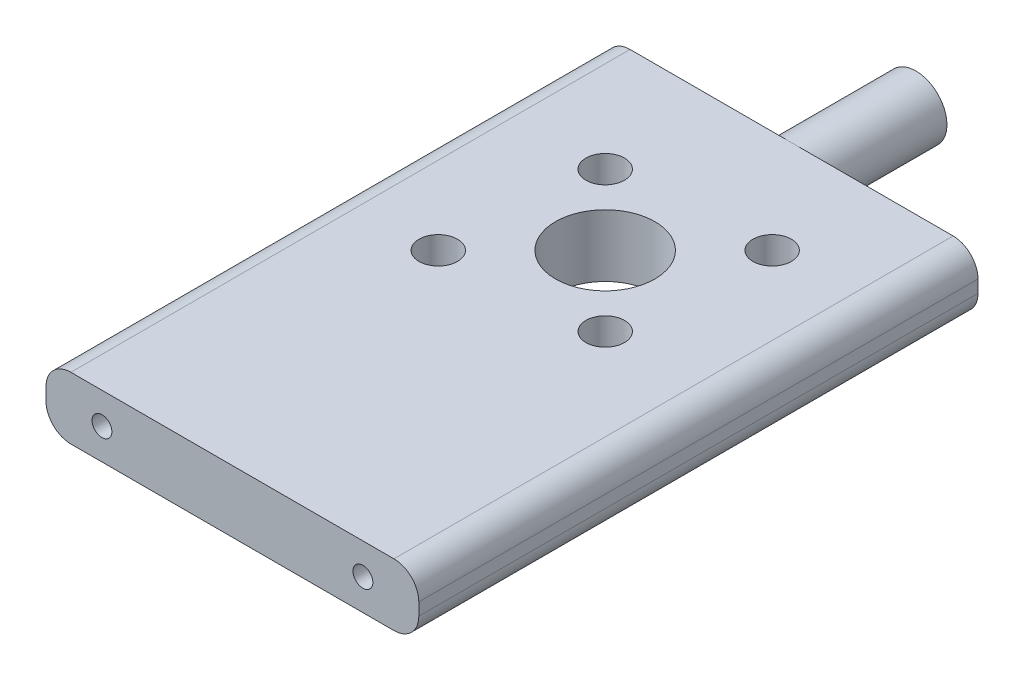
ISO-10303-21;
HEADER;
FILE_DESCRIPTION(('STEP AP214'),'2;1');
FILE_NAME('part.step','',(''),(''),'','','');
FILE_SCHEMA(('AUTOMOTIVE_DESIGN { 1 0 10303 214 1 1 1 1 }'));
ENDSEC;
DATA;
#1=APPLICATION_CONTEXT('core data for automotive mechanical design processes');
#2=APPLICATION_PROTOCOL_DEFINITION('international standard','automotive_design',2000,#1);
#3=PRODUCT_CONTEXT('',#1,'mechanical');
#4=PRODUCT('Part','Part','',(#3));
#5=PRODUCT_RELATED_PRODUCT_CATEGORY('part','',(#4));
#6=PRODUCT_DEFINITION_FORMATION('','',#4);
#7=PRODUCT_DEFINITION_CONTEXT('part definition',#1,'design');
#8=PRODUCT_DEFINITION('design','',#6,#7);
#9=PRODUCT_DEFINITION_SHAPE('','',#8);
#10=(LENGTH_UNIT() NAMED_UNIT(*) SI_UNIT(.MILLI.,.METRE.));
#11=(NAMED_UNIT(*) PLANE_ANGLE_UNIT() SI_UNIT($,.RADIAN.));
#12=(NAMED_UNIT(*) SI_UNIT($,.STERADIAN.) SOLID_ANGLE_UNIT());
#13=UNCERTAINTY_MEASURE_WITH_UNIT(LENGTH_MEASURE(1.E-05),#10,'distance_accuracy_value','');
#14=(GEOMETRIC_REPRESENTATION_CONTEXT(3) GLOBAL_UNCERTAINTY_ASSIGNED_CONTEXT((#13)) GLOBAL_UNIT_ASSIGNED_CONTEXT((#10,
#11,#12)) REPRESENTATION_CONTEXT('',''));
#15=CARTESIAN_POINT('',(0.,0.,0.));
#16=DIRECTION('',(0.,0.,1.));
#17=DIRECTION('',(1.,0.,0.));
#18=AXIS2_PLACEMENT_3D('',#15,#16,#17);
#19=CARTESIAN_POINT('',(22.6874179769715,5.,-26.1944918881506));
#20=DIRECTION('',(0.,0.,1.));
#21=DIRECTION('',(1.,0.,0.));
#22=AXIS2_PLACEMENT_3D('',#19,#20,#21);
#23=PLANE('',#22);
#24=DIRECTION('',(0.,-1.,0.));
#25=VECTOR('',#24,1.);
#26=CARTESIAN_POINT('',(22.6874179769715,5.,-26.1944918881506));
#27=LINE('',#26,#25);
#28=CARTESIAN_POINT('',(22.6874179769715,3.,-26.1944918881506));
#29=VERTEX_POINT('',#28);
#30=CARTESIAN_POINT('',(22.6874179769715,2.,-26.1944918881506));
#31=VERTEX_POINT('',#30);
#32=EDGE_CURVE('E132',#29,#31,#27,.T.);
#33=ORIENTED_EDGE('',*,*,#32,.T.);
#34=CARTESIAN_POINT('',(20.6874179769715,2.,-26.1944918881506));
#35=DIRECTION('',(0.,0.,1.));
#36=DIRECTION('',(1.,0.,0.));
#37=AXIS2_PLACEMENT_3D('',#34,#35,#36);
#38=CIRCLE('',#37,2.);
#39=CARTESIAN_POINT('',(20.6874179769715,0.,-26.1944918881506));
#40=VERTEX_POINT('',#39);
#41=EDGE_CURVE('E197',#31,#40,#38,.F.);
#42=ORIENTED_EDGE('',*,*,#41,.T.);
#43=DIRECTION('',(-1.,0.,0.));
#44=VECTOR('',#43,1.);
#45=CARTESIAN_POINT('',(22.6874179769715,0.,-26.1944918881506));
#46=LINE('',#45,#44);
#47=CARTESIAN_POINT('',(7.68741797697152,0.,-26.1944918881506));
#48=VERTEX_POINT('',#47);
#49=EDGE_CURVE('E126',#40,#48,#46,.T.);
#50=ORIENTED_EDGE('',*,*,#49,.T.);
#51=CARTESIAN_POINT('',(7.68741797697152,2.5,-26.1944918881506));
#52=DIRECTION('',(0.,0.,-1.));
#53=DIRECTION('',(-1.,0.,0.));
#54=AXIS2_PLACEMENT_3D('',#51,#52,#53);
#55=CIRCLE('',#54,2.5);
#56=CARTESIAN_POINT('',(7.68741797697152,5.,-26.1944918881506));
#57=VERTEX_POINT('',#56);
#58=EDGE_CURVE('E123',#57,#48,#55,.T.);
#59=ORIENTED_EDGE('',*,*,#58,.F.);
#60=DIRECTION('',(-1.,0.,0.));
#61=VECTOR('',#60,1.);
#62=CARTESIAN_POINT('',(22.6874179769715,5.,-26.1944918881506));
#63=LINE('',#62,#61);
#64=CARTESIAN_POINT('',(20.6874179769715,5.,-26.1944918881506));
#65=VERTEX_POINT('',#64);
#66=EDGE_CURVE('E105',#65,#57,#63,.T.);
#67=ORIENTED_EDGE('',*,*,#66,.F.);
#68=CARTESIAN_POINT('',(20.6874179769715,3.,-26.1944918881506));
#69=DIRECTION('',(0.,0.,1.));
#70=DIRECTION('',(1.,0.,0.));
#71=AXIS2_PLACEMENT_3D('',#68,#69,#70);
#72=CIRCLE('',#71,2.);
#73=EDGE_CURVE('E195',#65,#29,#72,.F.);
#74=ORIENTED_EDGE('',*,*,#73,.T.);
#75=EDGE_LOOP('',(#33,#42,#50,#59,#67,#74));
#76=FACE_BOUND('',#75,.T.);
#77=ADVANCED_FACE('F33',(#76),#23,.F.);
#78=CARTESIAN_POINT('',(-5.31258202302848,0.,-26.1944918881506));
#79=VERTEX_POINT('',#78);
#80=EDGE_CURVE('E179',#48,#79,#46,.T.);
#81=ORIENTED_EDGE('',*,*,#80,.T.);
#82=CARTESIAN_POINT('',(-5.31258202302848,2.,-26.1944918881506));
#83=DIRECTION('',(0.,0.,1.));
#84=DIRECTION('',(1.,0.,0.));
#85=AXIS2_PLACEMENT_3D('',#82,#83,#84);
#86=CIRCLE('',#85,2.);
#87=CARTESIAN_POINT('',(-7.31258202302848,2.,-26.1944918881506));
#88=VERTEX_POINT('',#87);
#89=EDGE_CURVE('E54',#79,#88,#86,.F.);
#90=ORIENTED_EDGE('',*,*,#89,.T.);
#91=DIRECTION('',(0.,-1.,0.));
#92=VECTOR('',#91,1.);
#93=CARTESIAN_POINT('',(-7.31258202302848,5.,-26.1944918881506));
#94=LINE('',#93,#92);
#95=CARTESIAN_POINT('',(-7.31258202302848,3.,-26.1944918881506));
#96=VERTEX_POINT('',#95);
#97=EDGE_CURVE('E135',#96,#88,#94,.T.);
#98=ORIENTED_EDGE('',*,*,#97,.F.);
#99=CARTESIAN_POINT('',(-5.31258202302848,3.,-26.1944918881506));
#100=DIRECTION('',(0.,0.,1.));
#101=DIRECTION('',(1.,0.,0.));
#102=AXIS2_PLACEMENT_3D('',#99,#100,#101);
#103=CIRCLE('',#102,2.);
#104=CARTESIAN_POINT('',(-5.31258202302848,5.,-26.1944918881506));
#105=VERTEX_POINT('',#104);
#106=EDGE_CURVE('E48',#96,#105,#103,.F.);
#107=ORIENTED_EDGE('',*,*,#106,.T.);
#108=EDGE_CURVE('E109',#57,#105,#63,.T.);
#109=ORIENTED_EDGE('',*,*,#108,.F.);
#110=EDGE_CURVE('E119',#48,#57,#55,.T.);
#111=ORIENTED_EDGE('',*,*,#110,.F.);
#112=EDGE_LOOP('',(#81,#90,#98,#107,#109,#111));
#113=FACE_BOUND('',#112,.T.);
#114=ADVANCED_FACE('F117',(#113),#23,.F.);
#115=CARTESIAN_POINT('',(22.6874179769715,5.,18.8055081118494));
#116=DIRECTION('',(-1.,0.,0.));
#117=DIRECTION('',(0.,0.,1.));
#118=AXIS2_PLACEMENT_3D('',#115,#116,#117);
#119=PLANE('',#118);
#120=DIRECTION('',(0.,-1.,0.));
#121=VECTOR('',#120,1.);
#122=CARTESIAN_POINT('',(22.6874179769715,5.,18.8055081118494));
#123=LINE('',#122,#121);
#124=CARTESIAN_POINT('',(22.6874179769715,3.,18.8055081118494));
#125=VERTEX_POINT('',#124);
#126=CARTESIAN_POINT('',(22.6874179769715,2.,18.8055081118494));
#127=VERTEX_POINT('',#126);
#128=EDGE_CURVE('E183',#125,#127,#123,.T.);
#129=ORIENTED_EDGE('',*,*,#128,.T.);
#130=DIRECTION('',(0.,0.,-1.));
#131=VECTOR('',#130,1.);
#132=CARTESIAN_POINT('',(22.6874179769715,2.,18.8055081118494));
#133=LINE('',#132,#131);
#134=EDGE_CURVE('E133',#127,#31,#133,.T.);
#135=ORIENTED_EDGE('',*,*,#134,.T.);
#136=ORIENTED_EDGE('',*,*,#32,.F.);
#137=DIRECTION('',(0.,0.,-1.));
#138=VECTOR('',#137,1.);
#139=CARTESIAN_POINT('',(22.6874179769715,3.,18.8055081118494));
#140=LINE('',#139,#138);
#141=EDGE_CURVE('E131',#29,#125,#140,.F.);
#142=ORIENTED_EDGE('',*,*,#141,.T.);
#143=EDGE_LOOP('',(#129,#135,#136,#142));
#144=FACE_BOUND('',#143,.T.);
#145=ADVANCED_FACE('F229',(#144),#119,.F.);
#146=CARTESIAN_POINT('',(-7.31258202302848,5.,18.8055081118494));
#147=DIRECTION('',(1.,0.,0.));
#148=DIRECTION('',(0.,0.,-1.));
#149=AXIS2_PLACEMENT_3D('',#146,#147,#148);
#150=PLANE('',#149);
#151=ORIENTED_EDGE('',*,*,#97,.T.);
#152=DIRECTION('',(0.,0.,1.));
#153=VECTOR('',#152,1.);
#154=CARTESIAN_POINT('',(-7.31258202302848,2.,18.8055081118494));
#155=LINE('',#154,#153);
#156=CARTESIAN_POINT('',(-7.31258202302848,2.,18.8055081118494));
#157=VERTEX_POINT('',#156);
#158=EDGE_CURVE('E213',#88,#157,#155,.T.);
#159=ORIENTED_EDGE('',*,*,#158,.T.);
#160=DIRECTION('',(0.,-1.,0.));
#161=VECTOR('',#160,1.);
#162=CARTESIAN_POINT('',(-7.31258202302848,5.,18.8055081118494));
#163=LINE('',#162,#161);
#164=CARTESIAN_POINT('',(-7.31258202302848,3.,18.8055081118494));
#165=VERTEX_POINT('',#164);
#166=EDGE_CURVE('E189',#165,#157,#163,.T.);
#167=ORIENTED_EDGE('',*,*,#166,.F.);
#168=DIRECTION('',(0.,0.,1.));
#169=VECTOR('',#168,1.);
#170=CARTESIAN_POINT('',(-7.31258202302848,3.,-26.1944918881506));
#171=LINE('',#170,#169);
#172=EDGE_CURVE('E211',#165,#96,#171,.F.);
#173=ORIENTED_EDGE('',*,*,#172,.T.);
#174=EDGE_LOOP('',(#151,#159,#167,#173));
#175=FACE_BOUND('',#174,.T.);
#176=ADVANCED_FACE('F243',(#175),#150,.F.);
#177=CARTESIAN_POINT('',(22.6874179769715,5.,18.8055081118494));
#178=DIRECTION('',(0.,0.,-1.));
#179=DIRECTION('',(-1.,0.,0.));
#180=AXIS2_PLACEMENT_3D('',#177,#178,#179);
#181=PLANE('',#180);
#182=CARTESIAN_POINT('',(18.1874179769715,2.5,18.8055081118494));
#183=DIRECTION('',(0.,0.,1.));
#184=DIRECTION('',(1.,0.,0.));
#185=AXIS2_PLACEMENT_3D('',#182,#183,#184);
#186=CIRCLE('',#185,0.799999999999999);
#187=CARTESIAN_POINT('',(18.9874179769715,2.5,18.8055081118494));
#188=VERTEX_POINT('',#187);
#189=EDGE_CURVE('E143',#188,#188,#186,.T.);
#190=ORIENTED_EDGE('',*,*,#189,.F.);
#191=EDGE_LOOP('',(#190));
#192=FACE_BOUND('',#191,.T.);
#193=CARTESIAN_POINT('',(-2.81258202302848,2.5,18.8055081118494));
#194=DIRECTION('',(0.,0.,1.));
#195=DIRECTION('',(1.,0.,0.));
#196=AXIS2_PLACEMENT_3D('',#193,#194,#195);
#197=CIRCLE('',#196,0.8);
#198=CARTESIAN_POINT('',(-2.01258202302848,2.5,18.8055081118494));
#199=VERTEX_POINT('',#198);
#200=EDGE_CURVE('E142',#199,#199,#197,.T.);
#201=ORIENTED_EDGE('',*,*,#200,.F.);
#202=EDGE_LOOP('',(#201));
#203=FACE_BOUND('',#202,.T.);
#204=DIRECTION('',(1.,0.,0.));
#205=VECTOR('',#204,1.);
#206=CARTESIAN_POINT('',(22.6874179769715,0.,18.8055081118494));
#207=LINE('',#206,#205);
#208=CARTESIAN_POINT('',(-5.31258202302848,0.,18.8055081118494));
#209=VERTEX_POINT('',#208);
#210=CARTESIAN_POINT('',(20.6874179769715,0.,18.8055081118494));
#211=VERTEX_POINT('',#210);
#212=EDGE_CURVE('E121',#209,#211,#207,.T.);
#213=ORIENTED_EDGE('',*,*,#212,.T.);
#214=CARTESIAN_POINT('',(20.6874179769715,2.,18.8055081118494));
#215=DIRECTION('',(0.,0.,-1.));
#216=DIRECTION('',(-1.,0.,0.));
#217=AXIS2_PLACEMENT_3D('',#214,#215,#216);
#218=CIRCLE('',#217,2.);
#219=EDGE_CURVE('E209',#211,#127,#218,.F.);
#220=ORIENTED_EDGE('',*,*,#219,.T.);
#221=ORIENTED_EDGE('',*,*,#128,.F.);
#222=CARTESIAN_POINT('',(20.6874179769715,3.,18.8055081118494));
#223=DIRECTION('',(0.,0.,-1.));
#224=DIRECTION('',(-1.,0.,0.));
#225=AXIS2_PLACEMENT_3D('',#222,#223,#224);
#226=CIRCLE('',#225,2.);
#227=CARTESIAN_POINT('',(20.6874179769715,5.,18.8055081118494));
#228=VERTEX_POINT('',#227);
#229=EDGE_CURVE('E205',#125,#228,#226,.F.);
#230=ORIENTED_EDGE('',*,*,#229,.T.);
#231=DIRECTION('',(1.,0.,0.));
#232=VECTOR('',#231,1.);
#233=CARTESIAN_POINT('',(22.6874179769715,5.,18.8055081118494));
#234=LINE('',#233,#232);
#235=CARTESIAN_POINT('',(-5.31258202302848,5.,18.8055081118494));
#236=VERTEX_POINT('',#235);
#237=EDGE_CURVE('E114',#236,#228,#234,.T.);
#238=ORIENTED_EDGE('',*,*,#237,.F.);
#239=CARTESIAN_POINT('',(-5.31258202302848,3.,18.8055081118494));
#240=DIRECTION('',(0.,0.,-1.));
#241=DIRECTION('',(-1.,0.,0.));
#242=AXIS2_PLACEMENT_3D('',#239,#240,#241);
#243=CIRCLE('',#242,2.);
#244=EDGE_CURVE('E203',#236,#165,#243,.F.);
#245=ORIENTED_EDGE('',*,*,#244,.T.);
#246=ORIENTED_EDGE('',*,*,#166,.T.);
#247=CARTESIAN_POINT('',(-5.31258202302848,2.,18.8055081118494));
#248=DIRECTION('',(0.,0.,-1.));
#249=DIRECTION('',(-1.,0.,0.));
#250=AXIS2_PLACEMENT_3D('',#247,#248,#249);
#251=CIRCLE('',#250,2.);
#252=EDGE_CURVE('E207',#157,#209,#251,.F.);
#253=ORIENTED_EDGE('',*,*,#252,.T.);
#254=EDGE_LOOP('',(#213,#220,#221,#230,#238,#245,#246,#253));
#255=FACE_BOUND('',#254,.T.);
#256=ADVANCED_FACE('F220',(#192,#203,#255),#181,.F.);
#257=CARTESIAN_POINT('',(0.,5.,0.));
#258=DIRECTION('',(0.,1.,0.));
#259=DIRECTION('',(0.,0.,1.));
#260=AXIS2_PLACEMENT_3D('',#257,#258,#259);
#261=PLANE('',#260);
#262=CARTESIAN_POINT('',(0.969903555699315,5.,-4.47697746687841));
#263=DIRECTION('',(0.,1.,0.));
#264=DIRECTION('',(0.,0.,1.));
#265=AXIS2_PLACEMENT_3D('',#262,#263,#264);
#266=CIRCLE('',#265,1.55);
#267=CARTESIAN_POINT('',(0.969903555699315,5.,-2.92697746687841));
#268=VERTEX_POINT('',#267);
#269=EDGE_CURVE('E149',#268,#268,#266,.T.);
#270=ORIENTED_EDGE('',*,*,#269,.F.);
#271=EDGE_LOOP('',(#270));
#272=FACE_BOUND('',#271,.T.);
#273=CARTESIAN_POINT('',(13.3442722264639,5.,-5.53763763865823));
#274=DIRECTION('',(0.,1.,0.));
#275=DIRECTION('',(0.,0.,1.));
#276=AXIS2_PLACEMENT_3D('',#273,#274,#275);
#277=CIRCLE('',#276,1.55);
#278=CARTESIAN_POINT('',(13.3442722264639,5.,-3.98763763865823));
#279=VERTEX_POINT('',#278);
#280=EDGE_CURVE('E155',#279,#279,#277,.T.);
#281=ORIENTED_EDGE('',*,*,#280,.F.);
#282=EDGE_LOOP('',(#281));
#283=FACE_BOUND('',#282,.T.);
#284=CARTESIAN_POINT('',(14.4049323982437,5.,-17.9120063094228));
#285=DIRECTION('',(0.,1.,0.));
#286=DIRECTION('',(0.,0.,1.));
#287=AXIS2_PLACEMENT_3D('',#284,#285,#286);
#288=CIRCLE('',#287,1.55);
#289=CARTESIAN_POINT('',(14.4049323982437,5.,-16.3620063094228));
#290=VERTEX_POINT('',#289);
#291=EDGE_CURVE('E161',#290,#290,#288,.T.);
#292=ORIENTED_EDGE('',*,*,#291,.F.);
#293=EDGE_LOOP('',(#292));
#294=FACE_BOUND('',#293,.T.);
#295=CARTESIAN_POINT('',(2.03056372747914,5.,-16.851346137643));
#296=DIRECTION('',(0.,1.,0.));
#297=DIRECTION('',(0.,0.,1.));
#298=AXIS2_PLACEMENT_3D('',#295,#296,#297);
#299=CIRCLE('',#298,1.55);
#300=CARTESIAN_POINT('',(2.03056372747914,5.,-15.301346137643));
#301=VERTEX_POINT('',#300);
#302=EDGE_CURVE('E167',#301,#301,#299,.T.);
#303=ORIENTED_EDGE('',*,*,#302,.F.);
#304=EDGE_LOOP('',(#303));
#305=FACE_BOUND('',#304,.T.);
#306=CARTESIAN_POINT('',(7.68741797697152,5.,-11.1944918881506));
#307=DIRECTION('',(0.,1.,0.));
#308=DIRECTION('',(0.,0.,1.));
#309=AXIS2_PLACEMENT_3D('',#306,#307,#308);
#310=CIRCLE('',#309,4.);
#311=CARTESIAN_POINT('',(7.68741797697152,5.,-7.19449188815061));
#312=VERTEX_POINT('',#311);
#313=EDGE_CURVE('E173',#312,#312,#310,.T.);
#314=ORIENTED_EDGE('',*,*,#313,.F.);
#315=EDGE_LOOP('',(#314));
#316=FACE_BOUND('',#315,.T.);
#317=ORIENTED_EDGE('',*,*,#237,.T.);
#318=DIRECTION('',(0.,0.,-1.));
#319=VECTOR('',#318,1.);
#320=CARTESIAN_POINT('',(20.6874179769715,5.,-26.1944918881506));
#321=LINE('',#320,#319);
#322=EDGE_CURVE('E11',#228,#65,#321,.T.);
#323=ORIENTED_EDGE('',*,*,#322,.T.);
#324=ORIENTED_EDGE('',*,*,#66,.T.);
#325=ORIENTED_EDGE('',*,*,#108,.T.);
#326=DIRECTION('',(0.,0.,1.));
#327=VECTOR('',#326,1.);
#328=CARTESIAN_POINT('',(-5.31258202302848,5.,18.8055081118494));
#329=LINE('',#328,#327);
#330=EDGE_CURVE('E41',#105,#236,#329,.T.);
#331=ORIENTED_EDGE('',*,*,#330,.T.);
#332=EDGE_LOOP('',(#317,#323,#324,#325,#331));
#333=FACE_BOUND('',#332,.T.);
#334=ADVANCED_FACE('F107',(#272,#283,#294,#305,#316,#333),#261,.T.);
#335=CARTESIAN_POINT('',(0.,0.,0.));
#336=DIRECTION('',(0.,1.,0.));
#337=DIRECTION('',(0.,0.,1.));
#338=AXIS2_PLACEMENT_3D('',#335,#336,#337);
#339=PLANE('',#338);
#340=CARTESIAN_POINT('',(0.969903555699315,0.,-4.47697746687841));
#341=DIRECTION('',(0.,1.,0.));
#342=DIRECTION('',(0.,0.,1.));
#343=AXIS2_PLACEMENT_3D('',#340,#341,#342);
#344=CIRCLE('',#343,1.55);
#345=CARTESIAN_POINT('',(0.969903555699315,0.,-2.92697746687841));
#346=VERTEX_POINT('',#345);
#347=EDGE_CURVE('E152',#346,#346,#344,.T.);
#348=ORIENTED_EDGE('',*,*,#347,.T.);
#349=EDGE_LOOP('',(#348));
#350=FACE_BOUND('',#349,.T.);
#351=CARTESIAN_POINT('',(13.3442722264639,0.,-5.53763763865823));
#352=DIRECTION('',(0.,1.,0.));
#353=DIRECTION('',(0.,0.,1.));
#354=AXIS2_PLACEMENT_3D('',#351,#352,#353);
#355=CIRCLE('',#354,1.55);
#356=CARTESIAN_POINT('',(13.3442722264639,0.,-3.98763763865823));
#357=VERTEX_POINT('',#356);
#358=EDGE_CURVE('E158',#357,#357,#355,.T.);
#359=ORIENTED_EDGE('',*,*,#358,.T.);
#360=EDGE_LOOP('',(#359));
#361=FACE_BOUND('',#360,.T.);
#362=CARTESIAN_POINT('',(14.4049323982437,0.,-17.9120063094228));
#363=DIRECTION('',(0.,1.,0.));
#364=DIRECTION('',(0.,0.,1.));
#365=AXIS2_PLACEMENT_3D('',#362,#363,#364);
#366=CIRCLE('',#365,1.55);
#367=CARTESIAN_POINT('',(14.4049323982437,0.,-16.3620063094228));
#368=VERTEX_POINT('',#367);
#369=EDGE_CURVE('E164',#368,#368,#366,.T.);
#370=ORIENTED_EDGE('',*,*,#369,.T.);
#371=EDGE_LOOP('',(#370));
#372=FACE_BOUND('',#371,.T.);
#373=CARTESIAN_POINT('',(2.03056372747914,0.,-16.851346137643));
#374=DIRECTION('',(0.,1.,0.));
#375=DIRECTION('',(0.,0.,1.));
#376=AXIS2_PLACEMENT_3D('',#373,#374,#375);
#377=CIRCLE('',#376,1.55);
#378=CARTESIAN_POINT('',(2.03056372747914,0.,-15.301346137643));
#379=VERTEX_POINT('',#378);
#380=EDGE_CURVE('E170',#379,#379,#377,.T.);
#381=ORIENTED_EDGE('',*,*,#380,.T.);
#382=EDGE_LOOP('',(#381));
#383=FACE_BOUND('',#382,.T.);
#384=CARTESIAN_POINT('',(7.68741797697152,0.,-11.1944918881506));
#385=DIRECTION('',(0.,1.,0.));
#386=DIRECTION('',(0.,0.,1.));
#387=AXIS2_PLACEMENT_3D('',#384,#385,#386);
#388=CIRCLE('',#387,4.);
#389=CARTESIAN_POINT('',(7.68741797697152,0.,-7.19449188815061));
#390=VERTEX_POINT('',#389);
#391=EDGE_CURVE('E176',#390,#390,#388,.T.);
#392=ORIENTED_EDGE('',*,*,#391,.T.);
#393=EDGE_LOOP('',(#392));
#394=FACE_BOUND('',#393,.T.);
#395=ORIENTED_EDGE('',*,*,#49,.F.);
#396=DIRECTION('',(0.,0.,-1.));
#397=VECTOR('',#396,1.);
#398=CARTESIAN_POINT('',(20.6874179769715,0.,0.));
#399=LINE('',#398,#397);
#400=EDGE_CURVE('E201',#40,#211,#399,.F.);
#401=ORIENTED_EDGE('',*,*,#400,.T.);
#402=ORIENTED_EDGE('',*,*,#212,.F.);
#403=DIRECTION('',(0.,0.,1.));
#404=VECTOR('',#403,1.);
#405=CARTESIAN_POINT('',(-5.31258202302848,0.,0.));
#406=LINE('',#405,#404);
#407=EDGE_CURVE('E199',#209,#79,#406,.F.);
#408=ORIENTED_EDGE('',*,*,#407,.T.);
#409=ORIENTED_EDGE('',*,*,#80,.F.);
#410=EDGE_LOOP('',(#395,#401,#402,#408,#409));
#411=FACE_BOUND('',#410,.T.);
#412=ADVANCED_FACE('F236',(#350,#361,#372,#383,#394,#411),#339,.F.);
#413=CARTESIAN_POINT('',(7.68741797697152,0.,-11.1944918881506));
#414=DIRECTION('',(0.,1.,0.));
#415=DIRECTION('',(0.,0.,1.));
#416=AXIS2_PLACEMENT_3D('',#413,#414,#415);
#417=CYLINDRICAL_SURFACE('',#416,4.);
#418=ORIENTED_EDGE('',*,*,#391,.F.);
#419=EDGE_LOOP('',(#418));
#420=FACE_BOUND('',#419,.T.);
#421=ORIENTED_EDGE('',*,*,#313,.T.);
#422=EDGE_LOOP('',(#421));
#423=FACE_BOUND('',#422,.T.);
#424=ADVANCED_FACE('F382',(#420,#423),#417,.F.);
#425=CARTESIAN_POINT('',(2.03056372747914,0.,-16.851346137643));
#426=DIRECTION('',(0.,1.,0.));
#427=DIRECTION('',(0.,0.,1.));
#428=AXIS2_PLACEMENT_3D('',#425,#426,#427);
#429=CYLINDRICAL_SURFACE('',#428,1.55);
#430=ORIENTED_EDGE('',*,*,#380,.F.);
#431=EDGE_LOOP('',(#430));
#432=FACE_BOUND('',#431,.T.);
#433=ORIENTED_EDGE('',*,*,#302,.T.);
#434=EDGE_LOOP('',(#433));
#435=FACE_BOUND('',#434,.T.);
#436=ADVANCED_FACE('F373',(#432,#435),#429,.F.);
#437=CARTESIAN_POINT('',(14.4049323982437,0.,-17.9120063094228));
#438=DIRECTION('',(0.,1.,0.));
#439=DIRECTION('',(0.,0.,1.));
#440=AXIS2_PLACEMENT_3D('',#437,#438,#439);
#441=CYLINDRICAL_SURFACE('',#440,1.55);
#442=ORIENTED_EDGE('',*,*,#369,.F.);
#443=EDGE_LOOP('',(#442));
#444=FACE_BOUND('',#443,.T.);
#445=ORIENTED_EDGE('',*,*,#291,.T.);
#446=EDGE_LOOP('',(#445));
#447=FACE_BOUND('',#446,.T.);
#448=ADVANCED_FACE('F364',(#444,#447),#441,.F.);
#449=CARTESIAN_POINT('',(13.3442722264639,0.,-5.53763763865823));
#450=DIRECTION('',(0.,1.,0.));
#451=DIRECTION('',(0.,0.,1.));
#452=AXIS2_PLACEMENT_3D('',#449,#450,#451);
#453=CYLINDRICAL_SURFACE('',#452,1.55);
#454=ORIENTED_EDGE('',*,*,#358,.F.);
#455=EDGE_LOOP('',(#454));
#456=FACE_BOUND('',#455,.T.);
#457=ORIENTED_EDGE('',*,*,#280,.T.);
#458=EDGE_LOOP('',(#457));
#459=FACE_BOUND('',#458,.T.);
#460=ADVANCED_FACE('F355',(#456,#459),#453,.F.);
#461=CARTESIAN_POINT('',(0.969903555699315,0.,-4.47697746687841));
#462=DIRECTION('',(0.,1.,0.));
#463=DIRECTION('',(0.,0.,1.));
#464=AXIS2_PLACEMENT_3D('',#461,#462,#463);
#465=CYLINDRICAL_SURFACE('',#464,1.55);
#466=ORIENTED_EDGE('',*,*,#347,.F.);
#467=EDGE_LOOP('',(#466));
#468=FACE_BOUND('',#467,.T.);
#469=ORIENTED_EDGE('',*,*,#269,.T.);
#470=EDGE_LOOP('',(#469));
#471=FACE_BOUND('',#470,.T.);
#472=ADVANCED_FACE('F346',(#468,#471),#465,.F.);
#473=CARTESIAN_POINT('',(-2.81258202302848,2.5,13.8055081118494));
#474=DIRECTION('',(0.,0.,1.));
#475=DIRECTION('',(1.,0.,0.));
#476=AXIS2_PLACEMENT_3D('',#473,#474,#475);
#477=CYLINDRICAL_SURFACE('',#476,0.8);
#478=CARTESIAN_POINT('',(-2.81258202302848,2.5,13.8055081118494));
#479=DIRECTION('',(0.,0.,1.));
#480=DIRECTION('',(1.,0.,0.));
#481=AXIS2_PLACEMENT_3D('',#478,#479,#480);
#482=CIRCLE('',#481,0.8);
#483=CARTESIAN_POINT('',(-2.01258202302848,2.5,13.8055081118494));
#484=VERTEX_POINT('',#483);
#485=EDGE_CURVE('E146',#484,#484,#482,.T.);
#486=ORIENTED_EDGE('',*,*,#485,.F.);
#487=EDGE_LOOP('',(#486));
#488=FACE_BOUND('',#487,.T.);
#489=ORIENTED_EDGE('',*,*,#200,.T.);
#490=EDGE_LOOP('',(#489));
#491=FACE_BOUND('',#490,.T.);
#492=ADVANCED_FACE('F337',(#488,#491),#477,.F.);
#493=CARTESIAN_POINT('',(-2.81258202302848,2.5,13.8055081118494));
#494=DIRECTION('',(0.,0.,1.));
#495=DIRECTION('',(1.,0.,0.));
#496=AXIS2_PLACEMENT_3D('',#493,#494,#495);
#497=PLANE('',#496);
#498=ORIENTED_EDGE('',*,*,#485,.T.);
#499=EDGE_LOOP('',(#498));
#500=FACE_BOUND('',#499,.T.);
#501=ADVANCED_FACE('F328',(#500),#497,.T.);
#502=CARTESIAN_POINT('',(18.1874179769715,2.5,13.8055081118494));
#503=DIRECTION('',(0.,0.,1.));
#504=DIRECTION('',(1.,0.,0.));
#505=AXIS2_PLACEMENT_3D('',#502,#503,#504);
#506=CYLINDRICAL_SURFACE('',#505,0.799999999999999);
#507=CARTESIAN_POINT('',(18.1874179769715,2.5,13.8055081118494));
#508=DIRECTION('',(0.,0.,1.));
#509=DIRECTION('',(1.,0.,0.));
#510=AXIS2_PLACEMENT_3D('',#507,#508,#509);
#511=CIRCLE('',#510,0.799999999999999);
#512=CARTESIAN_POINT('',(18.9874179769715,2.5,13.8055081118494));
#513=VERTEX_POINT('',#512);
#514=EDGE_CURVE('E139',#513,#513,#511,.T.);
#515=ORIENTED_EDGE('',*,*,#514,.F.);
#516=EDGE_LOOP('',(#515));
#517=FACE_BOUND('',#516,.T.);
#518=ORIENTED_EDGE('',*,*,#189,.T.);
#519=EDGE_LOOP('',(#518));
#520=FACE_BOUND('',#519,.T.);
#521=ADVANCED_FACE('F319',(#517,#520),#506,.F.);
#522=CARTESIAN_POINT('',(18.1874179769715,2.5,13.8055081118494));
#523=DIRECTION('',(0.,0.,1.));
#524=DIRECTION('',(1.,0.,0.));
#525=AXIS2_PLACEMENT_3D('',#522,#523,#524);
#526=PLANE('',#525);
#527=ORIENTED_EDGE('',*,*,#514,.T.);
#528=EDGE_LOOP('',(#527));
#529=FACE_BOUND('',#528,.T.);
#530=ADVANCED_FACE('F300',(#529),#526,.T.);
#531=CARTESIAN_POINT('',(7.68741797697152,2.5,-36.1944918881506));
#532=DIRECTION('',(0.,0.,1.));
#533=DIRECTION('',(1.,0.,0.));
#534=AXIS2_PLACEMENT_3D('',#531,#532,#533);
#535=CYLINDRICAL_SURFACE('',#534,2.5);
#536=CARTESIAN_POINT('',(7.68741797697152,2.5,-36.1944918881506));
#537=DIRECTION('',(0.,0.,-1.));
#538=DIRECTION('',(-1.,0.,0.));
#539=AXIS2_PLACEMENT_3D('',#536,#537,#538);
#540=CIRCLE('',#539,2.5);
#541=CARTESIAN_POINT('',(5.18741797697152,2.5,-36.1944918881506));
#542=VERTEX_POINT('',#541);
#543=EDGE_CURVE('E128',#542,#542,#540,.T.);
#544=ORIENTED_EDGE('',*,*,#543,.F.);
#545=EDGE_LOOP('',(#544));
#546=FACE_BOUND('',#545,.T.);
#547=ORIENTED_EDGE('',*,*,#58,.T.);
#548=ORIENTED_EDGE('',*,*,#110,.T.);
#549=EDGE_LOOP('',(#547,#548));
#550=FACE_BOUND('',#549,.T.);
#551=ADVANCED_FACE('F130',(#546,#550),#535,.T.);
#552=CARTESIAN_POINT('',(7.68741797697152,2.5,-36.1944918881506));
#553=DIRECTION('',(0.,0.,-1.));
#554=DIRECTION('',(-1.,0.,0.));
#555=AXIS2_PLACEMENT_3D('',#552,#553,#554);
#556=PLANE('',#555);
#557=ORIENTED_EDGE('',*,*,#543,.T.);
#558=EDGE_LOOP('',(#557));
#559=FACE_BOUND('',#558,.T.);
#560=ADVANCED_FACE('F262',(#559),#556,.T.);
#561=CARTESIAN_POINT('',(20.6874179769715,2.,18.8055081118494));
#562=DIRECTION('',(0.,0.,-1.));
#563=DIRECTION('',(-1.,0.,0.));
#564=AXIS2_PLACEMENT_3D('',#561,#562,#563);
#565=CYLINDRICAL_SURFACE('',#564,2.);
#566=ORIENTED_EDGE('',*,*,#219,.F.);
#567=ORIENTED_EDGE('',*,*,#400,.F.);
#568=ORIENTED_EDGE('',*,*,#41,.F.);
#569=ORIENTED_EDGE('',*,*,#134,.F.);
#570=EDGE_LOOP('',(#566,#567,#568,#569));
#571=FACE_BOUND('',#570,.T.);
#572=ADVANCED_FACE('F233',(#571),#565,.T.);
#573=CARTESIAN_POINT('',(-5.31258202302848,2.,18.8055081118494));
#574=DIRECTION('',(0.,0.,1.));
#575=DIRECTION('',(1.,0.,0.));
#576=AXIS2_PLACEMENT_3D('',#573,#574,#575);
#577=CYLINDRICAL_SURFACE('',#576,2.);
#578=ORIENTED_EDGE('',*,*,#89,.F.);
#579=ORIENTED_EDGE('',*,*,#407,.F.);
#580=ORIENTED_EDGE('',*,*,#252,.F.);
#581=ORIENTED_EDGE('',*,*,#158,.F.);
#582=EDGE_LOOP('',(#578,#579,#580,#581));
#583=FACE_BOUND('',#582,.T.);
#584=ADVANCED_FACE('F241',(#583),#577,.T.);
#585=CARTESIAN_POINT('',(20.6874179769715,3.,0.));
#586=DIRECTION('',(0.,0.,1.));
#587=DIRECTION('',(1.,0.,0.));
#588=AXIS2_PLACEMENT_3D('',#585,#586,#587);
#589=CYLINDRICAL_SURFACE('',#588,2.);
#590=ORIENTED_EDGE('',*,*,#229,.F.);
#591=ORIENTED_EDGE('',*,*,#141,.F.);
#592=ORIENTED_EDGE('',*,*,#73,.F.);
#593=ORIENTED_EDGE('',*,*,#322,.F.);
#594=EDGE_LOOP('',(#590,#591,#592,#593));
#595=FACE_BOUND('',#594,.T.);
#596=ADVANCED_FACE('F226',(#595),#589,.T.);
#597=CARTESIAN_POINT('',(-5.31258202302848,3.,0.));
#598=DIRECTION('',(0.,0.,-1.));
#599=DIRECTION('',(-1.,0.,0.));
#600=AXIS2_PLACEMENT_3D('',#597,#598,#599);
#601=CYLINDRICAL_SURFACE('',#600,2.);
#602=ORIENTED_EDGE('',*,*,#106,.F.);
#603=ORIENTED_EDGE('',*,*,#172,.F.);
#604=ORIENTED_EDGE('',*,*,#244,.F.);
#605=ORIENTED_EDGE('',*,*,#330,.F.);
#606=EDGE_LOOP('',(#602,#603,#604,#605));
#607=FACE_BOUND('',#606,.T.);
#608=ADVANCED_FACE('F35',(#607),#601,.T.);
#609=CLOSED_SHELL('',(#77,#114,#145,#176,#256,#334,#412,#424,#436,#448,#460,#472,#492,#501,#521,
#530,#551,#560,#572,#584,#596,#608));
#610=MANIFOLD_SOLID_BREP('B2',#609);
#611=ADVANCED_BREP_SHAPE_REPRESENTATION('',(#18,#610),#14);
#612=SHAPE_DEFINITION_REPRESENTATION(#9,#611);
ENDSEC;
END-ISO-10303-21;
